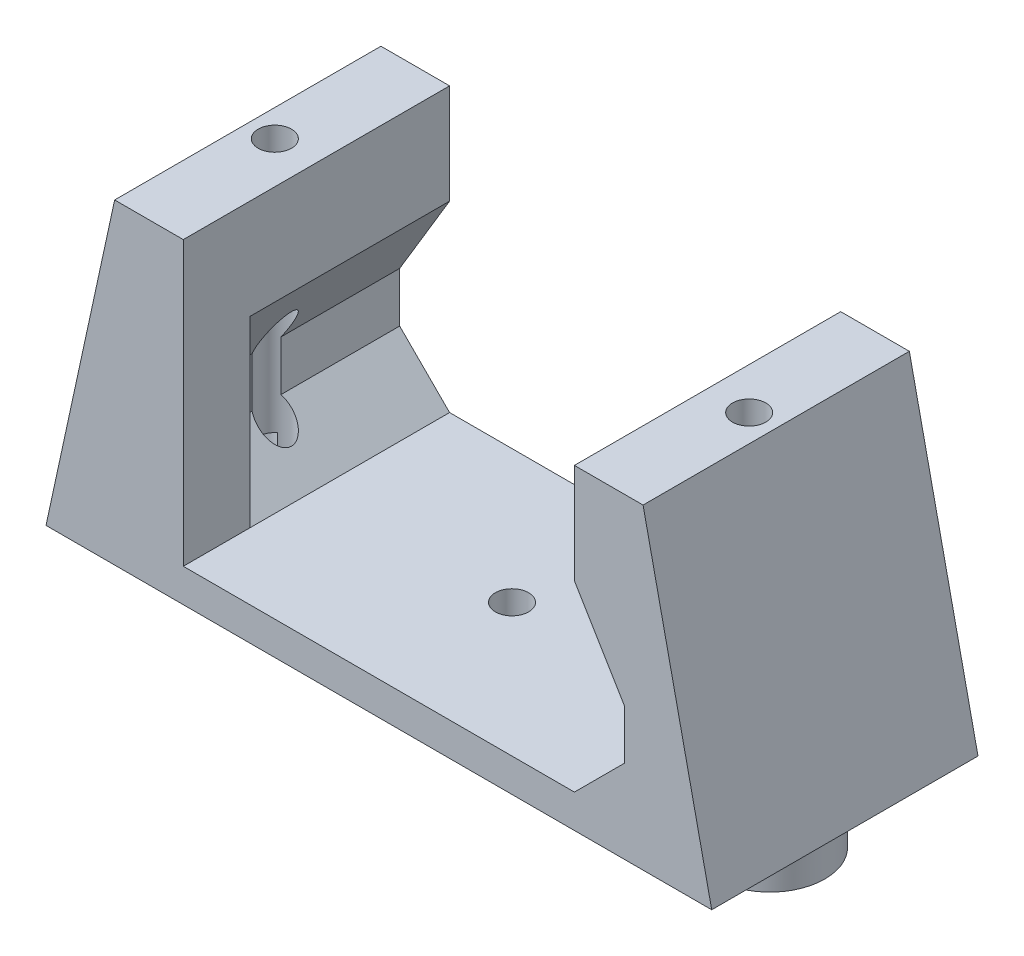
ISO-10303-21;
HEADER;
FILE_DESCRIPTION(('STEP AP214'),'2;1');
FILE_NAME('part.step','',(''),(''),'','','');
FILE_SCHEMA(('AUTOMOTIVE_DESIGN { 1 0 10303 214 1 1 1 1 }'));
ENDSEC;
DATA;
#1=APPLICATION_CONTEXT('core data for automotive mechanical design processes');
#2=APPLICATION_PROTOCOL_DEFINITION('international standard','automotive_design',2000,#1);
#3=PRODUCT_CONTEXT('',#1,'mechanical');
#4=PRODUCT('Part','Part','',(#3));
#5=PRODUCT_RELATED_PRODUCT_CATEGORY('part','',(#4));
#6=PRODUCT_DEFINITION_FORMATION('','',#4);
#7=PRODUCT_DEFINITION_CONTEXT('part definition',#1,'design');
#8=PRODUCT_DEFINITION('design','',#6,#7);
#9=PRODUCT_DEFINITION_SHAPE('','',#8);
#10=(LENGTH_UNIT() NAMED_UNIT(*) SI_UNIT(.MILLI.,.METRE.));
#11=(NAMED_UNIT(*) PLANE_ANGLE_UNIT() SI_UNIT($,.RADIAN.));
#12=(NAMED_UNIT(*) SI_UNIT($,.STERADIAN.) SOLID_ANGLE_UNIT());
#13=UNCERTAINTY_MEASURE_WITH_UNIT(LENGTH_MEASURE(1.E-05),#10,'distance_accuracy_value','');
#14=(GEOMETRIC_REPRESENTATION_CONTEXT(3) GLOBAL_UNCERTAINTY_ASSIGNED_CONTEXT((#13)) GLOBAL_UNIT_ASSIGNED_CONTEXT((#10,
#11,#12)) REPRESENTATION_CONTEXT('',''));
#15=CARTESIAN_POINT('',(0.,0.,0.));
#16=DIRECTION('',(0.,0.,1.));
#17=DIRECTION('',(1.,0.,0.));
#18=AXIS2_PLACEMENT_3D('',#15,#16,#17);
#19=CARTESIAN_POINT('',(14.25,19.,0.));
#20=DIRECTION('',(0.,-1.,0.));
#21=DIRECTION('',(0.,0.,-1.));
#22=AXIS2_PLACEMENT_3D('',#19,#20,#21);
#23=CYLINDRICAL_SURFACE('',#22,1.);
#24=CARTESIAN_POINT('',(14.25,19.,0.));
#25=DIRECTION('',(0.,1.,0.));
#26=DIRECTION('',(0.,0.,1.));
#27=AXIS2_PLACEMENT_3D('',#24,#25,#26);
#28=CIRCLE('',#27,1.);
#29=CARTESIAN_POINT('',(14.25,19.,1.));
#30=VERTEX_POINT('',#29);
#31=EDGE_CURVE('E305',#30,#30,#28,.T.);
#32=ORIENTED_EDGE('',*,*,#31,.T.);
#33=EDGE_LOOP('',(#32));
#34=FACE_BOUND('',#33,.T.);
#35=DIRECTION('',(0.,-1.,0.));
#36=VECTOR('',#35,1.);
#37=CARTESIAN_POINT('',(14.75,19.,-0.866025403784437));
#38=LINE('',#37,#36);
#39=CARTESIAN_POINT('',(14.75,5.,-0.866025403784437));
#40=VERTEX_POINT('',#39);
#41=CARTESIAN_POINT('',(14.75,8.,-0.866025403784437));
#42=VERTEX_POINT('',#41);
#43=EDGE_CURVE('E376',#40,#42,#38,.F.);
#44=ORIENTED_EDGE('',*,*,#43,.F.);
#45=CARTESIAN_POINT('',(14.25,4.50000000000001,0.));
#46=DIRECTION('',(-0.707106781186549,0.707106781186546,0.));
#47=DIRECTION('',(-0.707106781186546,-0.707106781186549,0.));
#48=AXIS2_PLACEMENT_3D('',#45,#46,#47);
#49=ELLIPSE('',#48,1.4142135623731,1.);
#50=CARTESIAN_POINT('',(14.75,5.,0.866025403784437));
#51=VERTEX_POINT('',#50);
#52=EDGE_CURVE('E384',#40,#51,#49,.T.);
#53=ORIENTED_EDGE('',*,*,#52,.T.);
#54=DIRECTION('',(0.,-1.,0.));
#55=VECTOR('',#54,1.);
#56=CARTESIAN_POINT('',(14.75,19.,0.866025403784437));
#57=LINE('',#56,#55);
#58=CARTESIAN_POINT('',(14.75,8.,0.866025403784437));
#59=VERTEX_POINT('',#58);
#60=EDGE_CURVE('E378',#59,#51,#57,.T.);
#61=ORIENTED_EDGE('',*,*,#60,.F.);
#62=CARTESIAN_POINT('',(14.25,8.83333333333334,0.));
#63=DIRECTION('',(-0.857492925712544,-0.514495755427527,0.));
#64=DIRECTION('',(0.514495755427527,-0.857492925712544,0.));
#65=AXIS2_PLACEMENT_3D('',#62,#63,#64);
#66=ELLIPSE('',#65,1.9436506316151,1.);
#67=EDGE_CURVE('E381',#59,#42,#66,.T.);
#68=ORIENTED_EDGE('',*,*,#67,.T.);
#69=EDGE_LOOP('',(#44,#53,#61,#68));
#70=FACE_BOUND('',#69,.T.);
#71=CARTESIAN_POINT('',(14.25,3.,0.));
#72=DIRECTION('',(0.,-1.,0.));
#73=DIRECTION('',(0.,0.,-1.));
#74=AXIS2_PLACEMENT_3D('',#71,#72,#73);
#75=CIRCLE('',#74,1.);
#76=CARTESIAN_POINT('',(14.875,3.,-0.780624749799798));
#77=VERTEX_POINT('',#76);
#78=CARTESIAN_POINT('',(14.875,3.,0.780624749799804));
#79=VERTEX_POINT('',#78);
#80=EDGE_CURVE('E11',#77,#79,#75,.T.);
#81=ORIENTED_EDGE('',*,*,#80,.T.);
#82=DIRECTION('',(0.,-1.,0.));
#83=VECTOR('',#82,1.);
#84=CARTESIAN_POINT('',(14.875,0.,0.780624749799804));
#85=LINE('',#84,#83);
#86=CARTESIAN_POINT('',(14.875,2.,0.780624749799803));
#87=VERTEX_POINT('',#86);
#88=EDGE_CURVE('E196',#79,#87,#85,.T.);
#89=ORIENTED_EDGE('',*,*,#88,.T.);
#90=CARTESIAN_POINT('',(14.25,2.,0.));
#91=DIRECTION('',(0.,1.,0.));
#92=DIRECTION('',(0.,0.,1.));
#93=AXIS2_PLACEMENT_3D('',#90,#91,#92);
#94=CIRCLE('',#93,1.);
#95=CARTESIAN_POINT('',(14.875,2.,-0.780624749799798));
#96=VERTEX_POINT('',#95);
#97=EDGE_CURVE('E201',#87,#96,#94,.F.);
#98=ORIENTED_EDGE('',*,*,#97,.T.);
#99=DIRECTION('',(0.,-1.,0.));
#100=VECTOR('',#99,1.);
#101=CARTESIAN_POINT('',(14.875,0.,-0.780624749799798));
#102=LINE('',#101,#100);
#103=EDGE_CURVE('E58',#96,#77,#102,.F.);
#104=ORIENTED_EDGE('',*,*,#103,.T.);
#105=EDGE_LOOP('',(#81,#89,#98,#104));
#106=FACE_BOUND('',#105,.T.);
#107=ADVANCED_FACE('F35',(#34,#70,#106),#23,.F.);
#108=CARTESIAN_POINT('',(0.,2.,8.));
#109=DIRECTION('',(0.,0.,-1.));
#110=DIRECTION('',(-1.,0.,0.));
#111=AXIS2_PLACEMENT_3D('',#108,#109,#110);
#112=PLANE('',#111);
#113=DIRECTION('',(0.,1.,0.));
#114=VECTOR('',#113,1.);
#115=CARTESIAN_POINT('',(14.75,0.,8.));
#116=LINE('',#115,#114);
#117=CARTESIAN_POINT('',(14.75,5.,8.));
#118=VERTEX_POINT('',#117);
#119=CARTESIAN_POINT('',(14.75,8.,8.));
#120=VERTEX_POINT('',#119);
#121=EDGE_CURVE('E215',#118,#120,#116,.T.);
#122=ORIENTED_EDGE('',*,*,#121,.F.);
#123=DIRECTION('',(-0.707106781186546,-0.707106781186549,0.));
#124=VECTOR('',#123,1.);
#125=CARTESIAN_POINT('',(14.75,5.,8.));
#126=LINE('',#125,#124);
#127=CARTESIAN_POINT('',(11.75,2.,8.));
#128=VERTEX_POINT('',#127);
#129=EDGE_CURVE('E386',#118,#128,#126,.T.);
#130=ORIENTED_EDGE('',*,*,#129,.T.);
#131=DIRECTION('',(1.,0.,0.));
#132=VECTOR('',#131,1.);
#133=CARTESIAN_POINT('',(0.,2.,8.));
#134=LINE('',#133,#132);
#135=CARTESIAN_POINT('',(-11.75,2.,8.));
#136=VERTEX_POINT('',#135);
#137=EDGE_CURVE('E345',#136,#128,#134,.T.);
#138=ORIENTED_EDGE('',*,*,#137,.F.);
#139=DIRECTION('',(0.,-1.,0.));
#140=VECTOR('',#139,1.);
#141=CARTESIAN_POINT('',(-11.75,19.,8.));
#142=LINE('',#141,#140);
#143=CARTESIAN_POINT('',(-11.75,19.,8.));
#144=VERTEX_POINT('',#143);
#145=EDGE_CURVE('E334',#144,#136,#142,.T.);
#146=ORIENTED_EDGE('',*,*,#145,.F.);
#147=DIRECTION('',(1.,0.,0.));
#148=VECTOR('',#147,1.);
#149=CARTESIAN_POINT('',(0.,19.,8.));
#150=LINE('',#149,#148);
#151=CARTESIAN_POINT('',(-15.875,19.,8.));
#152=VERTEX_POINT('',#151);
#153=EDGE_CURVE('E321',#152,#144,#150,.T.);
#154=ORIENTED_EDGE('',*,*,#153,.F.);
#155=DIRECTION('',(-0.212162721266312,-0.977234352499376,0.));
#156=VECTOR('',#155,1.);
#157=CARTESIAN_POINT('',(-19.0997395940975,4.14665399082379,8.));
#158=LINE('',#157,#156);
#159=CARTESIAN_POINT('',(-20.,0.,8.));
#160=VERTEX_POINT('',#159);
#161=EDGE_CURVE('E256',#152,#160,#158,.T.);
#162=ORIENTED_EDGE('',*,*,#161,.T.);
#163=DIRECTION('',(1.,0.,0.));
#164=VECTOR('',#163,1.);
#165=CARTESIAN_POINT('',(0.,0.,8.));
#166=LINE('',#165,#164);
#167=CARTESIAN_POINT('',(20.,0.,8.));
#168=VERTEX_POINT('',#167);
#169=EDGE_CURVE('E344',#160,#168,#166,.T.);
#170=ORIENTED_EDGE('',*,*,#169,.T.);
#171=DIRECTION('',(-0.212162721266312,0.977234352499376,0.));
#172=VECTOR('',#171,1.);
#173=CARTESIAN_POINT('',(19.0997395940975,4.14665399082379,8.));
#174=LINE('',#173,#172);
#175=CARTESIAN_POINT('',(15.875,19.,8.));
#176=VERTEX_POINT('',#175);
#177=EDGE_CURVE('E271',#168,#176,#174,.T.);
#178=ORIENTED_EDGE('',*,*,#177,.T.);
#179=DIRECTION('',(1.,0.,0.));
#180=VECTOR('',#179,1.);
#181=CARTESIAN_POINT('',(0.,19.,8.));
#182=LINE('',#181,#180);
#183=CARTESIAN_POINT('',(11.75,19.,8.));
#184=VERTEX_POINT('',#183);
#185=EDGE_CURVE('E302',#184,#176,#182,.T.);
#186=ORIENTED_EDGE('',*,*,#185,.F.);
#187=DIRECTION('',(0.,-1.,0.));
#188=VECTOR('',#187,1.);
#189=CARTESIAN_POINT('',(11.75,19.,8.));
#190=LINE('',#189,#188);
#191=CARTESIAN_POINT('',(11.75,13.,8.));
#192=VERTEX_POINT('',#191);
#193=EDGE_CURVE('E308',#184,#192,#190,.T.);
#194=ORIENTED_EDGE('',*,*,#193,.T.);
#195=DIRECTION('',(0.514495755427527,-0.857492925712544,0.));
#196=VECTOR('',#195,1.);
#197=CARTESIAN_POINT('',(14.375,8.625,8.));
#198=LINE('',#197,#196);
#199=EDGE_CURVE('E219',#192,#120,#198,.T.);
#200=ORIENTED_EDGE('',*,*,#199,.T.);
#201=EDGE_LOOP('',(#122,#130,#138,#146,#154,#162,#170,#178,#186,#194,#200));
#202=FACE_BOUND('',#201,.T.);
#203=ADVANCED_FACE('F426',(#202),#112,.F.);
#204=CARTESIAN_POINT('',(11.75,19.,0.));
#205=DIRECTION('',(-1.,0.,0.));
#206=DIRECTION('',(0.,0.,1.));
#207=AXIS2_PLACEMENT_3D('',#204,#205,#206);
#208=PLANE('',#207);
#209=DIRECTION('',(0.,0.,1.));
#210=VECTOR('',#209,1.);
#211=CARTESIAN_POINT('',(11.75,2.,0.));
#212=LINE('',#211,#210);
#213=CARTESIAN_POINT('',(11.75,2.,-8.));
#214=VERTEX_POINT('',#213);
#215=CARTESIAN_POINT('',(11.75,2.,-4.));
#216=VERTEX_POINT('',#215);
#217=EDGE_CURVE('E318',#214,#216,#212,.T.);
#218=ORIENTED_EDGE('',*,*,#217,.T.);
#219=DIRECTION('',(0.,-1.,0.));
#220=VECTOR('',#219,1.);
#221=CARTESIAN_POINT('',(11.75,0.,-4.));
#222=LINE('',#221,#220);
#223=CARTESIAN_POINT('',(11.75,13.,-4.));
#224=VERTEX_POINT('',#223);
#225=EDGE_CURVE('E216',#224,#216,#222,.T.);
#226=ORIENTED_EDGE('',*,*,#225,.F.);
#227=DIRECTION('',(0.,0.,1.));
#228=VECTOR('',#227,1.);
#229=CARTESIAN_POINT('',(11.75,13.,-4.));
#230=LINE('',#229,#228);
#231=EDGE_CURVE('E229',#224,#192,#230,.T.);
#232=ORIENTED_EDGE('',*,*,#231,.T.);
#233=ORIENTED_EDGE('',*,*,#193,.F.);
#234=DIRECTION('',(0.,0.,-1.));
#235=VECTOR('',#234,1.);
#236=CARTESIAN_POINT('',(11.75,19.,0.));
#237=LINE('',#236,#235);
#238=CARTESIAN_POINT('',(11.75,19.,-8.));
#239=VERTEX_POINT('',#238);
#240=EDGE_CURVE('E299',#184,#239,#237,.T.);
#241=ORIENTED_EDGE('',*,*,#240,.T.);
#242=DIRECTION('',(0.,-1.,0.));
#243=VECTOR('',#242,1.);
#244=CARTESIAN_POINT('',(11.75,19.,-8.));
#245=LINE('',#244,#243);
#246=EDGE_CURVE('E311',#239,#214,#245,.T.);
#247=ORIENTED_EDGE('',*,*,#246,.T.);
#248=EDGE_LOOP('',(#218,#226,#232,#233,#241,#247));
#249=FACE_BOUND('',#248,.T.);
#250=ADVANCED_FACE('F433',(#249),#208,.T.);
#251=CARTESIAN_POINT('',(0.,2.,-8.));
#252=DIRECTION('',(0.,0.,-1.));
#253=DIRECTION('',(-1.,0.,0.));
#254=AXIS2_PLACEMENT_3D('',#251,#252,#253);
#255=PLANE('',#254);
#256=DIRECTION('',(0.,1.,0.));
#257=VECTOR('',#256,1.);
#258=CARTESIAN_POINT('',(-14.75,0.,-8.));
#259=LINE('',#258,#257);
#260=CARTESIAN_POINT('',(-14.75,5.,-8.));
#261=VERTEX_POINT('',#260);
#262=CARTESIAN_POINT('',(-14.75,8.,-8.));
#263=VERTEX_POINT('',#262);
#264=EDGE_CURVE('E232',#261,#263,#259,.T.);
#265=ORIENTED_EDGE('',*,*,#264,.F.);
#266=DIRECTION('',(-0.707106781186547,0.707106781186548,0.));
#267=VECTOR('',#266,1.);
#268=CARTESIAN_POINT('',(-5.87500000000002,-3.87500000000001,-8.));
#269=LINE('',#268,#267);
#270=CARTESIAN_POINT('',(-11.75,2.,-8.));
#271=VERTEX_POINT('',#270);
#272=EDGE_CURVE('E390',#261,#271,#269,.F.);
#273=ORIENTED_EDGE('',*,*,#272,.T.);
#274=DIRECTION('',(1.,0.,0.));
#275=VECTOR('',#274,1.);
#276=CARTESIAN_POINT('',(0.,2.,-8.));
#277=LINE('',#276,#275);
#278=EDGE_CURVE('E340',#271,#214,#277,.T.);
#279=ORIENTED_EDGE('',*,*,#278,.T.);
#280=ORIENTED_EDGE('',*,*,#246,.F.);
#281=DIRECTION('',(1.,0.,0.));
#282=VECTOR('',#281,1.);
#283=CARTESIAN_POINT('',(0.,19.,-8.));
#284=LINE('',#283,#282);
#285=CARTESIAN_POINT('',(15.875,19.,-8.));
#286=VERTEX_POINT('',#285);
#287=EDGE_CURVE('E296',#239,#286,#284,.T.);
#288=ORIENTED_EDGE('',*,*,#287,.T.);
#289=DIRECTION('',(-0.212162721266312,0.977234352499376,0.));
#290=VECTOR('',#289,1.);
#291=CARTESIAN_POINT('',(19.0997395940975,4.14665399082379,-8.));
#292=LINE('',#291,#290);
#293=CARTESIAN_POINT('',(20.,0.,-8.));
#294=VERTEX_POINT('',#293);
#295=EDGE_CURVE('E272',#294,#286,#292,.T.);
#296=ORIENTED_EDGE('',*,*,#295,.F.);
#297=DIRECTION('',(1.,0.,0.));
#298=VECTOR('',#297,1.);
#299=CARTESIAN_POINT('',(0.,0.,-8.));
#300=LINE('',#299,#298);
#301=CARTESIAN_POINT('',(-20.,0.,-8.));
#302=VERTEX_POINT('',#301);
#303=EDGE_CURVE('E355',#302,#294,#300,.T.);
#304=ORIENTED_EDGE('',*,*,#303,.F.);
#305=DIRECTION('',(-0.212162721266312,-0.977234352499376,0.));
#306=VECTOR('',#305,1.);
#307=CARTESIAN_POINT('',(-19.0997395940975,4.14665399082379,-8.));
#308=LINE('',#307,#306);
#309=CARTESIAN_POINT('',(-15.875,19.,-8.));
#310=VERTEX_POINT('',#309);
#311=EDGE_CURVE('E264',#310,#302,#308,.T.);
#312=ORIENTED_EDGE('',*,*,#311,.F.);
#313=DIRECTION('',(1.,0.,0.));
#314=VECTOR('',#313,1.);
#315=CARTESIAN_POINT('',(0.,19.,-8.));
#316=LINE('',#315,#314);
#317=CARTESIAN_POINT('',(-11.75,19.,-8.));
#318=VERTEX_POINT('',#317);
#319=EDGE_CURVE('E326',#310,#318,#316,.T.);
#320=ORIENTED_EDGE('',*,*,#319,.T.);
#321=DIRECTION('',(0.,-1.,0.));
#322=VECTOR('',#321,1.);
#323=CARTESIAN_POINT('',(-11.75,19.,-8.));
#324=LINE('',#323,#322);
#325=CARTESIAN_POINT('',(-11.75,13.,-8.));
#326=VERTEX_POINT('',#325);
#327=EDGE_CURVE('E331',#318,#326,#324,.T.);
#328=ORIENTED_EDGE('',*,*,#327,.T.);
#329=DIRECTION('',(-0.514495755427526,-0.857492925712544,0.));
#330=VECTOR('',#329,1.);
#331=CARTESIAN_POINT('',(-14.375,8.625,-8.));
#332=LINE('',#331,#330);
#333=EDGE_CURVE('E244',#326,#263,#332,.T.);
#334=ORIENTED_EDGE('',*,*,#333,.T.);
#335=EDGE_LOOP('',(#265,#273,#279,#280,#288,#296,#304,#312,#320,#328,#334));
#336=FACE_BOUND('',#335,.T.);
#337=ADVANCED_FACE('F442',(#336),#255,.T.);
#338=CARTESIAN_POINT('',(0.,19.,0.));
#339=DIRECTION('',(0.,1.,0.));
#340=DIRECTION('',(0.,0.,1.));
#341=AXIS2_PLACEMENT_3D('',#338,#339,#340);
#342=PLANE('',#341);
#343=CARTESIAN_POINT('',(-14.25,19.,0.));
#344=DIRECTION('',(0.,1.,0.));
#345=DIRECTION('',(0.,0.,1.));
#346=AXIS2_PLACEMENT_3D('',#343,#344,#345);
#347=CIRCLE('',#346,1.);
#348=CARTESIAN_POINT('',(-14.25,19.,1.));
#349=VERTEX_POINT('',#348);
#350=EDGE_CURVE('E328',#349,#349,#347,.T.);
#351=ORIENTED_EDGE('',*,*,#350,.F.);
#352=EDGE_LOOP('',(#351));
#353=FACE_BOUND('',#352,.T.);
#354=ORIENTED_EDGE('',*,*,#319,.F.);
#355=DIRECTION('',(0.,0.,1.));
#356=VECTOR('',#355,1.);
#357=CARTESIAN_POINT('',(-15.875,19.,-8.));
#358=LINE('',#357,#356);
#359=EDGE_CURVE('E266',#310,#152,#358,.T.);
#360=ORIENTED_EDGE('',*,*,#359,.T.);
#361=ORIENTED_EDGE('',*,*,#153,.T.);
#362=DIRECTION('',(0.,0.,-1.));
#363=VECTOR('',#362,1.);
#364=CARTESIAN_POINT('',(-11.75,19.,0.));
#365=LINE('',#364,#363);
#366=EDGE_CURVE('E323',#144,#318,#365,.T.);
#367=ORIENTED_EDGE('',*,*,#366,.T.);
#368=EDGE_LOOP('',(#354,#360,#361,#367));
#369=FACE_BOUND('',#368,.T.);
#370=ADVANCED_FACE('F444',(#353,#369),#342,.T.);
#371=CARTESIAN_POINT('',(0.,19.,0.));
#372=DIRECTION('',(0.,1.,0.));
#373=DIRECTION('',(0.,0.,1.));
#374=AXIS2_PLACEMENT_3D('',#371,#372,#373);
#375=PLANE('',#374);
#376=ORIENTED_EDGE('',*,*,#31,.F.);
#377=EDGE_LOOP('',(#376));
#378=FACE_BOUND('',#377,.T.);
#379=ORIENTED_EDGE('',*,*,#185,.T.);
#380=DIRECTION('',(0.,0.,1.));
#381=VECTOR('',#380,1.);
#382=CARTESIAN_POINT('',(15.875,19.,-8.));
#383=LINE('',#382,#381);
#384=EDGE_CURVE('E274',#286,#176,#383,.T.);
#385=ORIENTED_EDGE('',*,*,#384,.F.);
#386=ORIENTED_EDGE('',*,*,#287,.F.);
#387=ORIENTED_EDGE('',*,*,#240,.F.);
#388=EDGE_LOOP('',(#379,#385,#386,#387));
#389=FACE_BOUND('',#388,.T.);
#390=ADVANCED_FACE('F423',(#378,#389),#375,.T.);
#391=CARTESIAN_POINT('',(0.,2.,0.));
#392=DIRECTION('',(0.,1.,0.));
#393=DIRECTION('',(0.,0.,1.));
#394=AXIS2_PLACEMENT_3D('',#391,#392,#393);
#395=PLANE('',#394);
#396=CARTESIAN_POINT('',(0.,2.,0.));
#397=DIRECTION('',(0.,1.,0.));
#398=DIRECTION('',(0.,0.,1.));
#399=AXIS2_PLACEMENT_3D('',#396,#397,#398);
#400=CIRCLE('',#399,1.);
#401=CARTESIAN_POINT('',(0.,2.,1.));
#402=VERTEX_POINT('',#401);
#403=EDGE_CURVE('E212',#402,#402,#400,.T.);
#404=ORIENTED_EDGE('',*,*,#403,.F.);
#405=EDGE_LOOP('',(#404));
#406=FACE_BOUND('',#405,.T.);
#407=ORIENTED_EDGE('',*,*,#217,.F.);
#408=ORIENTED_EDGE('',*,*,#278,.F.);
#409=DIRECTION('',(0.,0.,1.));
#410=VECTOR('',#409,1.);
#411=CARTESIAN_POINT('',(-11.75,2.,0.));
#412=LINE('',#411,#410);
#413=CARTESIAN_POINT('',(-11.75,2.,4.));
#414=VERTEX_POINT('',#413);
#415=EDGE_CURVE('E341',#271,#414,#412,.T.);
#416=ORIENTED_EDGE('',*,*,#415,.T.);
#417=EDGE_CURVE('E337',#414,#136,#412,.T.);
#418=ORIENTED_EDGE('',*,*,#417,.T.);
#419=ORIENTED_EDGE('',*,*,#137,.T.);
#420=EDGE_CURVE('E314',#216,#128,#212,.T.);
#421=ORIENTED_EDGE('',*,*,#420,.F.);
#422=EDGE_LOOP('',(#407,#408,#416,#418,#419,#421));
#423=FACE_BOUND('',#422,.T.);
#424=ADVANCED_FACE('F411',(#406,#423),#395,.T.);
#425=CARTESIAN_POINT('',(0.,0.,0.));
#426=DIRECTION('',(0.,1.,0.));
#427=DIRECTION('',(0.,0.,1.));
#428=AXIS2_PLACEMENT_3D('',#425,#426,#427);
#429=PLANE('',#428);
#430=CARTESIAN_POINT('',(15.5,0.,0.));
#431=DIRECTION('',(0.,1.,0.));
#432=DIRECTION('',(0.,0.,1.));
#433=AXIS2_PLACEMENT_3D('',#430,#431,#432);
#434=CIRCLE('',#433,3.3);
#435=CARTESIAN_POINT('',(15.5,0.,3.30000000000001));
#436=VERTEX_POINT('',#435);
#437=EDGE_CURVE('E365',#436,#436,#434,.F.);
#438=ORIENTED_EDGE('',*,*,#437,.F.);
#439=EDGE_LOOP('',(#438));
#440=FACE_BOUND('',#439,.T.);
#441=CARTESIAN_POINT('',(0.,0.,0.));
#442=DIRECTION('',(0.,1.,0.));
#443=DIRECTION('',(0.,0.,1.));
#444=AXIS2_PLACEMENT_3D('',#441,#442,#443);
#445=CIRCLE('',#444,3.3);
#446=CARTESIAN_POINT('',(0.,0.,3.3));
#447=VERTEX_POINT('',#446);
#448=EDGE_CURVE('E362',#447,#447,#445,.F.);
#449=ORIENTED_EDGE('',*,*,#448,.F.);
#450=EDGE_LOOP('',(#449));
#451=FACE_BOUND('',#450,.T.);
#452=CARTESIAN_POINT('',(-15.5,0.,0.));
#453=DIRECTION('',(0.,1.,0.));
#454=DIRECTION('',(0.,0.,1.));
#455=AXIS2_PLACEMENT_3D('',#452,#453,#454);
#456=CIRCLE('',#455,3.3);
#457=CARTESIAN_POINT('',(-15.5,0.,3.3));
#458=VERTEX_POINT('',#457);
#459=EDGE_CURVE('E316',#458,#458,#456,.F.);
#460=ORIENTED_EDGE('',*,*,#459,.F.);
#461=EDGE_LOOP('',(#460));
#462=FACE_BOUND('',#461,.T.);
#463=DIRECTION('',(0.,0.,-1.));
#464=VECTOR('',#463,1.);
#465=CARTESIAN_POINT('',(20.,0.,0.));
#466=LINE('',#465,#464);
#467=EDGE_CURVE('E353',#168,#294,#466,.T.);
#468=ORIENTED_EDGE('',*,*,#467,.F.);
#469=ORIENTED_EDGE('',*,*,#169,.F.);
#470=DIRECTION('',(0.,0.,-1.));
#471=VECTOR('',#470,1.);
#472=CARTESIAN_POINT('',(-20.,0.,0.));
#473=LINE('',#472,#471);
#474=EDGE_CURVE('E348',#160,#302,#473,.T.);
#475=ORIENTED_EDGE('',*,*,#474,.T.);
#476=ORIENTED_EDGE('',*,*,#303,.T.);
#477=EDGE_LOOP('',(#468,#469,#475,#476));
#478=FACE_BOUND('',#477,.T.);
#479=ADVANCED_FACE('F422',(#440,#451,#462,#478),#429,.F.);
#480=CARTESIAN_POINT('',(-11.75,19.,0.));
#481=DIRECTION('',(-1.,0.,0.));
#482=DIRECTION('',(0.,0.,1.));
#483=AXIS2_PLACEMENT_3D('',#480,#481,#482);
#484=PLANE('',#483);
#485=ORIENTED_EDGE('',*,*,#417,.F.);
#486=DIRECTION('',(0.,-1.,0.));
#487=VECTOR('',#486,1.);
#488=CARTESIAN_POINT('',(-11.75,0.,4.));
#489=LINE('',#488,#487);
#490=CARTESIAN_POINT('',(-11.75,13.,4.));
#491=VERTEX_POINT('',#490);
#492=EDGE_CURVE('E246',#491,#414,#489,.T.);
#493=ORIENTED_EDGE('',*,*,#492,.F.);
#494=DIRECTION('',(0.,0.,-1.));
#495=VECTOR('',#494,1.);
#496=CARTESIAN_POINT('',(-11.75,13.,4.));
#497=LINE('',#496,#495);
#498=EDGE_CURVE('E253',#491,#326,#497,.T.);
#499=ORIENTED_EDGE('',*,*,#498,.T.);
#500=ORIENTED_EDGE('',*,*,#327,.F.);
#501=ORIENTED_EDGE('',*,*,#366,.F.);
#502=ORIENTED_EDGE('',*,*,#145,.T.);
#503=EDGE_LOOP('',(#485,#493,#499,#500,#501,#502));
#504=FACE_BOUND('',#503,.T.);
#505=ADVANCED_FACE('F417',(#504),#484,.F.);
#506=CARTESIAN_POINT('',(-14.25,19.,0.));
#507=DIRECTION('',(0.,-1.,0.));
#508=DIRECTION('',(0.,0.,-1.));
#509=AXIS2_PLACEMENT_3D('',#506,#507,#508);
#510=CYLINDRICAL_SURFACE('',#509,1.);
#511=DIRECTION('',(0.,-1.,0.));
#512=VECTOR('',#511,1.);
#513=CARTESIAN_POINT('',(-14.875,0.,-0.780624749799803));
#514=LINE('',#513,#512);
#515=CARTESIAN_POINT('',(-14.875,2.,-0.780624749799802));
#516=VERTEX_POINT('',#515);
#517=CARTESIAN_POINT('',(-14.875,3.,-0.780624749799803));
#518=VERTEX_POINT('',#517);
#519=EDGE_CURVE('E210',#516,#518,#514,.F.);
#520=ORIENTED_EDGE('',*,*,#519,.F.);
#521=CARTESIAN_POINT('',(-14.25,2.,0.));
#522=DIRECTION('',(0.,1.,0.));
#523=DIRECTION('',(0.,0.,1.));
#524=AXIS2_PLACEMENT_3D('',#521,#522,#523);
#525=CIRCLE('',#524,1.);
#526=CARTESIAN_POINT('',(-14.875,2.,0.780624749799799));
#527=VERTEX_POINT('',#526);
#528=EDGE_CURVE('E317',#516,#527,#525,.F.);
#529=ORIENTED_EDGE('',*,*,#528,.T.);
#530=DIRECTION('',(0.,-1.,0.));
#531=VECTOR('',#530,1.);
#532=CARTESIAN_POINT('',(-14.875,0.,0.780624749799799));
#533=LINE('',#532,#531);
#534=CARTESIAN_POINT('',(-14.875,3.,0.780624749799799));
#535=VERTEX_POINT('',#534);
#536=EDGE_CURVE('E50',#535,#527,#533,.T.);
#537=ORIENTED_EDGE('',*,*,#536,.F.);
#538=CARTESIAN_POINT('',(-14.25,3.,0.));
#539=DIRECTION('',(0.,-1.,0.));
#540=DIRECTION('',(0.,0.,-1.));
#541=AXIS2_PLACEMENT_3D('',#538,#539,#540);
#542=CIRCLE('',#541,1.);
#543=EDGE_CURVE('E43',#535,#518,#542,.T.);
#544=ORIENTED_EDGE('',*,*,#543,.T.);
#545=EDGE_LOOP('',(#520,#529,#537,#544));
#546=FACE_BOUND('',#545,.T.);
#547=DIRECTION('',(0.,-1.,0.));
#548=VECTOR('',#547,1.);
#549=CARTESIAN_POINT('',(-14.75,19.,0.866025403784439));
#550=LINE('',#549,#548);
#551=CARTESIAN_POINT('',(-14.75,5.,0.866025403784439));
#552=VERTEX_POINT('',#551);
#553=CARTESIAN_POINT('',(-14.75,8.,0.866025403784439));
#554=VERTEX_POINT('',#553);
#555=EDGE_CURVE('E368',#552,#554,#550,.F.);
#556=ORIENTED_EDGE('',*,*,#555,.F.);
#557=CARTESIAN_POINT('',(-14.25,4.49999999999999,0.));
#558=DIRECTION('',(-0.707106781186548,-0.707106781186547,0.));
#559=DIRECTION('',(0.707106781186547,-0.707106781186548,0.));
#560=AXIS2_PLACEMENT_3D('',#557,#558,#559);
#561=ELLIPSE('',#560,1.4142135623731,1.);
#562=CARTESIAN_POINT('',(-14.75,5.,-0.866025403784439));
#563=VERTEX_POINT('',#562);
#564=EDGE_CURVE('E388',#552,#563,#561,.F.);
#565=ORIENTED_EDGE('',*,*,#564,.T.);
#566=DIRECTION('',(0.,-1.,0.));
#567=VECTOR('',#566,1.);
#568=CARTESIAN_POINT('',(-14.75,19.,-0.866025403784439));
#569=LINE('',#568,#567);
#570=CARTESIAN_POINT('',(-14.75,8.,-0.866025403784439));
#571=VERTEX_POINT('',#570);
#572=EDGE_CURVE('E373',#571,#563,#569,.T.);
#573=ORIENTED_EDGE('',*,*,#572,.F.);
#574=CARTESIAN_POINT('',(-14.25,8.83333333333333,0.));
#575=DIRECTION('',(0.857492925712544,-0.514495755427527,0.));
#576=DIRECTION('',(-0.514495755427527,-0.857492925712544,0.));
#577=AXIS2_PLACEMENT_3D('',#574,#575,#576);
#578=ELLIPSE('',#577,1.9436506316151,1.);
#579=EDGE_CURVE('E370',#571,#554,#578,.T.);
#580=ORIENTED_EDGE('',*,*,#579,.T.);
#581=EDGE_LOOP('',(#556,#565,#573,#580));
#582=FACE_BOUND('',#581,.T.);
#583=ORIENTED_EDGE('',*,*,#350,.T.);
#584=EDGE_LOOP('',(#583));
#585=FACE_BOUND('',#584,.T.);
#586=ADVANCED_FACE('F398',(#546,#582,#585),#510,.F.);
#587=CARTESIAN_POINT('',(-15.5,2.,0.));
#588=DIRECTION('',(0.,1.,0.));
#589=DIRECTION('',(0.,0.,1.));
#590=AXIS2_PLACEMENT_3D('',#587,#588,#589);
#591=CIRCLE('',#590,1.);
#592=EDGE_CURVE('E204',#527,#516,#591,.T.);
#593=ORIENTED_EDGE('',*,*,#592,.F.);
#594=ORIENTED_EDGE('',*,*,#528,.F.);
#595=EDGE_LOOP('',(#593,#594));
#596=FACE_BOUND('',#595,.T.);
#597=ADVANCED_FACE('F407',(#596),#395,.T.);
#598=ORIENTED_EDGE('',*,*,#97,.F.);
#599=CARTESIAN_POINT('',(15.5,2.,0.));
#600=DIRECTION('',(0.,1.,0.));
#601=DIRECTION('',(0.,0.,1.));
#602=AXIS2_PLACEMENT_3D('',#599,#600,#601);
#603=CIRCLE('',#602,1.);
#604=EDGE_CURVE('E202',#87,#96,#603,.F.);
#605=ORIENTED_EDGE('',*,*,#604,.T.);
#606=EDGE_LOOP('',(#598,#605));
#607=FACE_BOUND('',#606,.T.);
#608=ADVANCED_FACE('F409',(#607),#395,.T.);
#609=CARTESIAN_POINT('',(-15.5,-3.,0.));
#610=DIRECTION('',(0.,1.,0.));
#611=DIRECTION('',(0.,0.,1.));
#612=AXIS2_PLACEMENT_3D('',#609,#610,#611);
#613=CYLINDRICAL_SURFACE('',#612,1.);
#614=CARTESIAN_POINT('',(-15.5,-3.,0.));
#615=DIRECTION('',(0.,-1.,0.));
#616=DIRECTION('',(0.,0.,-1.));
#617=AXIS2_PLACEMENT_3D('',#614,#615,#616);
#618=CIRCLE('',#617,1.);
#619=CARTESIAN_POINT('',(-15.5,-3.,-1.00000000000001));
#620=VERTEX_POINT('',#619);
#621=EDGE_CURVE('E290',#620,#620,#618,.T.);
#622=ORIENTED_EDGE('',*,*,#621,.T.);
#623=EDGE_LOOP('',(#622));
#624=FACE_BOUND('',#623,.T.);
#625=ORIENTED_EDGE('',*,*,#519,.T.);
#626=CARTESIAN_POINT('',(-15.5,3.,0.));
#627=DIRECTION('',(0.,-1.,0.));
#628=DIRECTION('',(0.,0.,-1.));
#629=AXIS2_PLACEMENT_3D('',#626,#627,#628);
#630=CIRCLE('',#629,1.);
#631=EDGE_CURVE('E197',#535,#518,#630,.T.);
#632=ORIENTED_EDGE('',*,*,#631,.F.);
#633=ORIENTED_EDGE('',*,*,#536,.T.);
#634=ORIENTED_EDGE('',*,*,#592,.T.);
#635=EDGE_LOOP('',(#625,#632,#633,#634));
#636=FACE_BOUND('',#635,.T.);
#637=ADVANCED_FACE('F404',(#624,#636),#613,.F.);
#638=CARTESIAN_POINT('',(-15.5,-3.,0.));
#639=DIRECTION('',(0.,1.,0.));
#640=DIRECTION('',(0.,0.,1.));
#641=AXIS2_PLACEMENT_3D('',#638,#639,#640);
#642=CYLINDRICAL_SURFACE('',#641,3.3);
#643=CARTESIAN_POINT('',(-15.5,-3.,0.));
#644=DIRECTION('',(0.,-1.,0.));
#645=DIRECTION('',(0.,0.,-1.));
#646=AXIS2_PLACEMENT_3D('',#643,#644,#645);
#647=CIRCLE('',#646,3.3);
#648=CARTESIAN_POINT('',(-15.5,-3.,-3.30000000000001));
#649=VERTEX_POINT('',#648);
#650=EDGE_CURVE('E293',#649,#649,#647,.T.);
#651=ORIENTED_EDGE('',*,*,#650,.F.);
#652=EDGE_LOOP('',(#651));
#653=FACE_BOUND('',#652,.T.);
#654=ORIENTED_EDGE('',*,*,#459,.T.);
#655=EDGE_LOOP('',(#654));
#656=FACE_BOUND('',#655,.T.);
#657=ADVANCED_FACE('F563',(#653,#656),#642,.T.);
#658=CARTESIAN_POINT('',(0.,-3.,0.));
#659=DIRECTION('',(0.,-1.,0.));
#660=DIRECTION('',(0.,0.,-1.));
#661=AXIS2_PLACEMENT_3D('',#658,#659,#660);
#662=PLANE('',#661);
#663=ORIENTED_EDGE('',*,*,#621,.F.);
#664=EDGE_LOOP('',(#663));
#665=FACE_BOUND('',#664,.T.);
#666=ORIENTED_EDGE('',*,*,#650,.T.);
#667=EDGE_LOOP('',(#666));
#668=FACE_BOUND('',#667,.T.);
#669=ADVANCED_FACE('F559',(#665,#668),#662,.T.);
#670=CARTESIAN_POINT('',(0.,-3.,0.));
#671=DIRECTION('',(0.,1.,0.));
#672=DIRECTION('',(0.,0.,1.));
#673=AXIS2_PLACEMENT_3D('',#670,#671,#672);
#674=CYLINDRICAL_SURFACE('',#673,3.3);
#675=CARTESIAN_POINT('',(0.,-3.,0.));
#676=DIRECTION('',(0.,-1.,0.));
#677=DIRECTION('',(0.,0.,-1.));
#678=AXIS2_PLACEMENT_3D('',#675,#676,#677);
#679=CIRCLE('',#678,3.3);
#680=CARTESIAN_POINT('',(0.,-3.,-3.3));
#681=VERTEX_POINT('',#680);
#682=EDGE_CURVE('E284',#681,#681,#679,.T.);
#683=ORIENTED_EDGE('',*,*,#682,.F.);
#684=EDGE_LOOP('',(#683));
#685=FACE_BOUND('',#684,.T.);
#686=ORIENTED_EDGE('',*,*,#448,.T.);
#687=EDGE_LOOP('',(#686));
#688=FACE_BOUND('',#687,.T.);
#689=ADVANCED_FACE('F555',(#685,#688),#674,.T.);
#690=CARTESIAN_POINT('',(0.,-3.,0.));
#691=DIRECTION('',(0.,1.,0.));
#692=DIRECTION('',(0.,0.,1.));
#693=AXIS2_PLACEMENT_3D('',#690,#691,#692);
#694=CYLINDRICAL_SURFACE('',#693,1.);
#695=CARTESIAN_POINT('',(0.,-3.,0.));
#696=DIRECTION('',(0.,-1.,0.));
#697=DIRECTION('',(0.,0.,-1.));
#698=AXIS2_PLACEMENT_3D('',#695,#696,#697);
#699=CIRCLE('',#698,1.);
#700=CARTESIAN_POINT('',(0.,-3.,-1.));
#701=VERTEX_POINT('',#700);
#702=EDGE_CURVE('E287',#701,#701,#699,.T.);
#703=ORIENTED_EDGE('',*,*,#702,.T.);
#704=EDGE_LOOP('',(#703));
#705=FACE_BOUND('',#704,.T.);
#706=ORIENTED_EDGE('',*,*,#403,.T.);
#707=EDGE_LOOP('',(#706));
#708=FACE_BOUND('',#707,.T.);
#709=ADVANCED_FACE('F551',(#705,#708),#694,.F.);
#710=CARTESIAN_POINT('',(0.,-3.,0.));
#711=DIRECTION('',(0.,-1.,0.));
#712=DIRECTION('',(0.,0.,-1.));
#713=AXIS2_PLACEMENT_3D('',#710,#711,#712);
#714=PLANE('',#713);
#715=ORIENTED_EDGE('',*,*,#682,.T.);
#716=EDGE_LOOP('',(#715));
#717=FACE_BOUND('',#716,.T.);
#718=ORIENTED_EDGE('',*,*,#702,.F.);
#719=EDGE_LOOP('',(#718));
#720=FACE_BOUND('',#719,.T.);
#721=ADVANCED_FACE('F547',(#717,#720),#714,.T.);
#722=CARTESIAN_POINT('',(15.5,-3.,0.));
#723=DIRECTION('',(0.,1.,0.));
#724=DIRECTION('',(0.,0.,1.));
#725=AXIS2_PLACEMENT_3D('',#722,#723,#724);
#726=CYLINDRICAL_SURFACE('',#725,3.3);
#727=CARTESIAN_POINT('',(15.5,-3.,0.));
#728=DIRECTION('',(0.,-1.,0.));
#729=DIRECTION('',(0.,0.,-1.));
#730=AXIS2_PLACEMENT_3D('',#727,#728,#729);
#731=CIRCLE('',#730,3.3);
#732=CARTESIAN_POINT('',(15.5,-3.,-3.3));
#733=VERTEX_POINT('',#732);
#734=EDGE_CURVE('E278',#733,#733,#731,.T.);
#735=ORIENTED_EDGE('',*,*,#734,.F.);
#736=EDGE_LOOP('',(#735));
#737=FACE_BOUND('',#736,.T.);
#738=ORIENTED_EDGE('',*,*,#437,.T.);
#739=EDGE_LOOP('',(#738));
#740=FACE_BOUND('',#739,.T.);
#741=ADVANCED_FACE('F543',(#737,#740),#726,.T.);
#742=CARTESIAN_POINT('',(15.5,-3.,0.));
#743=DIRECTION('',(0.,1.,0.));
#744=DIRECTION('',(0.,0.,1.));
#745=AXIS2_PLACEMENT_3D('',#742,#743,#744);
#746=CYLINDRICAL_SURFACE('',#745,1.);
#747=CARTESIAN_POINT('',(15.5,-3.,0.));
#748=DIRECTION('',(0.,-1.,0.));
#749=DIRECTION('',(0.,0.,-1.));
#750=AXIS2_PLACEMENT_3D('',#747,#748,#749);
#751=CIRCLE('',#750,1.);
#752=CARTESIAN_POINT('',(15.5,-3.,-0.999999999999996));
#753=VERTEX_POINT('',#752);
#754=EDGE_CURVE('E281',#753,#753,#751,.T.);
#755=ORIENTED_EDGE('',*,*,#754,.T.);
#756=EDGE_LOOP('',(#755));
#757=FACE_BOUND('',#756,.T.);
#758=CARTESIAN_POINT('',(15.5,3.,0.));
#759=DIRECTION('',(0.,-1.,0.));
#760=DIRECTION('',(0.,0.,-1.));
#761=AXIS2_PLACEMENT_3D('',#758,#759,#760);
#762=CIRCLE('',#761,1.);
#763=EDGE_CURVE('E192',#79,#77,#762,.F.);
#764=ORIENTED_EDGE('',*,*,#763,.T.);
#765=ORIENTED_EDGE('',*,*,#103,.F.);
#766=ORIENTED_EDGE('',*,*,#604,.F.);
#767=ORIENTED_EDGE('',*,*,#88,.F.);
#768=EDGE_LOOP('',(#764,#765,#766,#767));
#769=FACE_BOUND('',#768,.T.);
#770=ADVANCED_FACE('F195',(#757,#769),#746,.F.);
#771=CARTESIAN_POINT('',(0.,-3.,0.));
#772=DIRECTION('',(0.,-1.,0.));
#773=DIRECTION('',(0.,0.,-1.));
#774=AXIS2_PLACEMENT_3D('',#771,#772,#773);
#775=PLANE('',#774);
#776=ORIENTED_EDGE('',*,*,#734,.T.);
#777=EDGE_LOOP('',(#776));
#778=FACE_BOUND('',#777,.T.);
#779=ORIENTED_EDGE('',*,*,#754,.F.);
#780=EDGE_LOOP('',(#779));
#781=FACE_BOUND('',#780,.T.);
#782=ADVANCED_FACE('F534',(#778,#781),#775,.T.);
#783=CARTESIAN_POINT('',(19.0997395940975,4.14665399082379,-8.));
#784=DIRECTION('',(0.977234352499375,0.212162721266312,0.));
#785=DIRECTION('',(-0.212162721266312,0.977234352499375,0.));
#786=AXIS2_PLACEMENT_3D('',#783,#784,#785);
#787=PLANE('',#786);
#788=ORIENTED_EDGE('',*,*,#177,.F.);
#789=ORIENTED_EDGE('',*,*,#467,.T.);
#790=ORIENTED_EDGE('',*,*,#295,.T.);
#791=ORIENTED_EDGE('',*,*,#384,.T.);
#792=EDGE_LOOP('',(#788,#789,#790,#791));
#793=FACE_BOUND('',#792,.T.);
#794=ADVANCED_FACE('F527',(#793),#787,.T.);
#795=CARTESIAN_POINT('',(-19.0997395940975,4.14665399082379,-8.));
#796=DIRECTION('',(-0.977234352499375,0.212162721266312,0.));
#797=DIRECTION('',(-0.212162721266312,-0.977234352499375,0.));
#798=AXIS2_PLACEMENT_3D('',#795,#796,#797);
#799=PLANE('',#798);
#800=ORIENTED_EDGE('',*,*,#161,.F.);
#801=ORIENTED_EDGE('',*,*,#359,.F.);
#802=ORIENTED_EDGE('',*,*,#311,.T.);
#803=ORIENTED_EDGE('',*,*,#474,.F.);
#804=EDGE_LOOP('',(#800,#801,#802,#803));
#805=FACE_BOUND('',#804,.T.);
#806=ADVANCED_FACE('F525',(#805),#799,.T.);
#807=CARTESIAN_POINT('',(-14.75,0.,4.));
#808=DIRECTION('',(-1.,0.,0.));
#809=DIRECTION('',(0.,0.,1.));
#810=AXIS2_PLACEMENT_3D('',#807,#808,#809);
#811=PLANE('',#810);
#812=ORIENTED_EDGE('',*,*,#572,.T.);
#813=DIRECTION('',(0.,0.,-1.));
#814=VECTOR('',#813,1.);
#815=CARTESIAN_POINT('',(-14.75,5.,4.));
#816=LINE('',#815,#814);
#817=EDGE_CURVE('E248',#563,#261,#816,.T.);
#818=ORIENTED_EDGE('',*,*,#817,.T.);
#819=ORIENTED_EDGE('',*,*,#264,.T.);
#820=DIRECTION('',(0.,0.,-1.));
#821=VECTOR('',#820,1.);
#822=CARTESIAN_POINT('',(-14.75,8.,4.));
#823=LINE('',#822,#821);
#824=EDGE_CURVE('E260',#571,#263,#823,.T.);
#825=ORIENTED_EDGE('',*,*,#824,.F.);
#826=EDGE_LOOP('',(#812,#818,#819,#825));
#827=FACE_BOUND('',#826,.T.);
#828=ADVANCED_FACE('F481',(#827),#811,.F.);
#829=CARTESIAN_POINT('',(-14.375,8.625,4.));
#830=DIRECTION('',(0.857492925712544,-0.514495755427527,0.));
#831=DIRECTION('',(0.514495755427527,0.857492925712544,0.));
#832=AXIS2_PLACEMENT_3D('',#829,#830,#831);
#833=PLANE('',#832);
#834=ORIENTED_EDGE('',*,*,#824,.T.);
#835=ORIENTED_EDGE('',*,*,#333,.F.);
#836=ORIENTED_EDGE('',*,*,#498,.F.);
#837=DIRECTION('',(-0.514495755427526,-0.857492925712544,0.));
#838=VECTOR('',#837,1.);
#839=CARTESIAN_POINT('',(-14.375,8.625,4.));
#840=LINE('',#839,#838);
#841=CARTESIAN_POINT('',(-14.75,8.,4.));
#842=VERTEX_POINT('',#841);
#843=EDGE_CURVE('E243',#491,#842,#840,.T.);
#844=ORIENTED_EDGE('',*,*,#843,.T.);
#845=EDGE_CURVE('E257',#842,#554,#823,.T.);
#846=ORIENTED_EDGE('',*,*,#845,.T.);
#847=ORIENTED_EDGE('',*,*,#579,.F.);
#848=EDGE_LOOP('',(#834,#835,#836,#844,#846,#847));
#849=FACE_BOUND('',#848,.T.);
#850=ADVANCED_FACE('F474',(#849),#833,.T.);
#851=ORIENTED_EDGE('',*,*,#555,.T.);
#852=ORIENTED_EDGE('',*,*,#845,.F.);
#853=DIRECTION('',(0.,1.,0.));
#854=VECTOR('',#853,1.);
#855=CARTESIAN_POINT('',(-14.75,0.,4.));
#856=LINE('',#855,#854);
#857=CARTESIAN_POINT('',(-14.75,5.,4.));
#858=VERTEX_POINT('',#857);
#859=EDGE_CURVE('E240',#858,#842,#856,.T.);
#860=ORIENTED_EDGE('',*,*,#859,.F.);
#861=EDGE_CURVE('E261',#858,#552,#816,.T.);
#862=ORIENTED_EDGE('',*,*,#861,.T.);
#863=EDGE_LOOP('',(#851,#852,#860,#862));
#864=FACE_BOUND('',#863,.T.);
#865=ADVANCED_FACE('F471',(#864),#811,.F.);
#866=CARTESIAN_POINT('',(0.,0.,4.));
#867=DIRECTION('',(0.,0.,-1.));
#868=DIRECTION('',(-1.,0.,0.));
#869=AXIS2_PLACEMENT_3D('',#866,#867,#868);
#870=PLANE('',#869);
#871=ORIENTED_EDGE('',*,*,#492,.T.);
#872=DIRECTION('',(0.707106781186547,-0.707106781186548,0.));
#873=VECTOR('',#872,1.);
#874=CARTESIAN_POINT('',(-14.75,5.,4.));
#875=LINE('',#874,#873);
#876=EDGE_CURVE('E394',#414,#858,#875,.F.);
#877=ORIENTED_EDGE('',*,*,#876,.T.);
#878=ORIENTED_EDGE('',*,*,#859,.T.);
#879=ORIENTED_EDGE('',*,*,#843,.F.);
#880=EDGE_LOOP('',(#871,#877,#878,#879));
#881=FACE_BOUND('',#880,.T.);
#882=ADVANCED_FACE('F468',(#881),#870,.T.);
#883=CARTESIAN_POINT('',(14.75,0.,-4.));
#884=DIRECTION('',(1.,0.,0.));
#885=DIRECTION('',(0.,0.,-1.));
#886=AXIS2_PLACEMENT_3D('',#883,#884,#885);
#887=PLANE('',#886);
#888=ORIENTED_EDGE('',*,*,#60,.T.);
#889=DIRECTION('',(0.,0.,1.));
#890=VECTOR('',#889,1.);
#891=CARTESIAN_POINT('',(14.75,5.,-4.));
#892=LINE('',#891,#890);
#893=EDGE_CURVE('E224',#51,#118,#892,.T.);
#894=ORIENTED_EDGE('',*,*,#893,.T.);
#895=ORIENTED_EDGE('',*,*,#121,.T.);
#896=DIRECTION('',(0.,0.,1.));
#897=VECTOR('',#896,1.);
#898=CARTESIAN_POINT('',(14.75,8.,-4.));
#899=LINE('',#898,#897);
#900=EDGE_CURVE('E236',#59,#120,#899,.T.);
#901=ORIENTED_EDGE('',*,*,#900,.F.);
#902=EDGE_LOOP('',(#888,#894,#895,#901));
#903=FACE_BOUND('',#902,.T.);
#904=ADVANCED_FACE('F511',(#903),#887,.F.);
#905=CARTESIAN_POINT('',(14.375,8.625,-4.));
#906=DIRECTION('',(-0.857492925712544,-0.514495755427527,0.));
#907=DIRECTION('',(0.514495755427527,-0.857492925712544,0.));
#908=AXIS2_PLACEMENT_3D('',#905,#906,#907);
#909=PLANE('',#908);
#910=ORIENTED_EDGE('',*,*,#900,.T.);
#911=ORIENTED_EDGE('',*,*,#199,.F.);
#912=ORIENTED_EDGE('',*,*,#231,.F.);
#913=DIRECTION('',(0.514495755427527,-0.857492925712544,0.));
#914=VECTOR('',#913,1.);
#915=CARTESIAN_POINT('',(14.375,8.625,-4.));
#916=LINE('',#915,#914);
#917=CARTESIAN_POINT('',(14.75,8.,-4.));
#918=VERTEX_POINT('',#917);
#919=EDGE_CURVE('E222',#224,#918,#916,.T.);
#920=ORIENTED_EDGE('',*,*,#919,.T.);
#921=EDGE_CURVE('E233',#918,#42,#899,.T.);
#922=ORIENTED_EDGE('',*,*,#921,.T.);
#923=ORIENTED_EDGE('',*,*,#67,.F.);
#924=EDGE_LOOP('',(#910,#911,#912,#920,#922,#923));
#925=FACE_BOUND('',#924,.T.);
#926=ADVANCED_FACE('F506',(#925),#909,.T.);
#927=ORIENTED_EDGE('',*,*,#43,.T.);
#928=ORIENTED_EDGE('',*,*,#921,.F.);
#929=DIRECTION('',(0.,1.,0.));
#930=VECTOR('',#929,1.);
#931=CARTESIAN_POINT('',(14.75,0.,-4.));
#932=LINE('',#931,#930);
#933=CARTESIAN_POINT('',(14.75,5.,-4.));
#934=VERTEX_POINT('',#933);
#935=EDGE_CURVE('E218',#934,#918,#932,.T.);
#936=ORIENTED_EDGE('',*,*,#935,.F.);
#937=EDGE_CURVE('E237',#934,#40,#892,.T.);
#938=ORIENTED_EDGE('',*,*,#937,.T.);
#939=EDGE_LOOP('',(#927,#928,#936,#938));
#940=FACE_BOUND('',#939,.T.);
#941=ADVANCED_FACE('F503',(#940),#887,.F.);
#942=CARTESIAN_POINT('',(0.,0.,-4.));
#943=DIRECTION('',(0.,0.,1.));
#944=DIRECTION('',(1.,0.,0.));
#945=AXIS2_PLACEMENT_3D('',#942,#943,#944);
#946=PLANE('',#945);
#947=ORIENTED_EDGE('',*,*,#225,.T.);
#948=DIRECTION('',(0.707106781186546,0.707106781186549,0.));
#949=VECTOR('',#948,1.);
#950=CARTESIAN_POINT('',(14.75,5.,-4.));
#951=LINE('',#950,#949);
#952=EDGE_CURVE('E392',#216,#934,#951,.T.);
#953=ORIENTED_EDGE('',*,*,#952,.T.);
#954=ORIENTED_EDGE('',*,*,#935,.T.);
#955=ORIENTED_EDGE('',*,*,#919,.F.);
#956=EDGE_LOOP('',(#947,#953,#954,#955));
#957=FACE_BOUND('',#956,.T.);
#958=ADVANCED_FACE('F499',(#957),#946,.T.);
#959=CARTESIAN_POINT('',(14.75,5.,-4.));
#960=DIRECTION('',(-0.707106781186549,0.707106781186546,0.));
#961=DIRECTION('',(0.,0.,-1.));
#962=AXIS2_PLACEMENT_3D('',#959,#960,#961);
#963=PLANE('',#962);
#964=ORIENTED_EDGE('',*,*,#952,.F.);
#965=ORIENTED_EDGE('',*,*,#420,.T.);
#966=ORIENTED_EDGE('',*,*,#129,.F.);
#967=ORIENTED_EDGE('',*,*,#893,.F.);
#968=ORIENTED_EDGE('',*,*,#52,.F.);
#969=ORIENTED_EDGE('',*,*,#937,.F.);
#970=EDGE_LOOP('',(#964,#965,#966,#967,#968,#969));
#971=FACE_BOUND('',#970,.T.);
#972=ADVANCED_FACE('F494',(#971),#963,.T.);
#973=CARTESIAN_POINT('',(-14.75,5.,4.));
#974=DIRECTION('',(-0.707106781186548,-0.707106781186547,0.));
#975=DIRECTION('',(0.,0.,-1.));
#976=AXIS2_PLACEMENT_3D('',#973,#974,#975);
#977=PLANE('',#976);
#978=ORIENTED_EDGE('',*,*,#876,.F.);
#979=ORIENTED_EDGE('',*,*,#415,.F.);
#980=ORIENTED_EDGE('',*,*,#272,.F.);
#981=ORIENTED_EDGE('',*,*,#817,.F.);
#982=ORIENTED_EDGE('',*,*,#564,.F.);
#983=ORIENTED_EDGE('',*,*,#861,.F.);
#984=EDGE_LOOP('',(#978,#979,#980,#981,#982,#983));
#985=FACE_BOUND('',#984,.T.);
#986=ADVANCED_FACE('F37',(#985),#977,.F.);
#987=CARTESIAN_POINT('',(0.,3.,0.));
#988=DIRECTION('',(0.,-1.,0.));
#989=DIRECTION('',(0.,0.,-1.));
#990=AXIS2_PLACEMENT_3D('',#987,#988,#989);
#991=PLANE('',#990);
#992=ORIENTED_EDGE('',*,*,#763,.F.);
#993=ORIENTED_EDGE('',*,*,#80,.F.);
#994=EDGE_LOOP('',(#992,#993));
#995=FACE_BOUND('',#994,.T.);
#996=ADVANCED_FACE('F191',(#995),#991,.T.);
#997=CARTESIAN_POINT('',(0.,3.,0.));
#998=DIRECTION('',(0.,-1.,0.));
#999=DIRECTION('',(0.,0.,-1.));
#1000=AXIS2_PLACEMENT_3D('',#997,#998,#999);
#1001=PLANE('',#1000);
#1002=ORIENTED_EDGE('',*,*,#631,.T.);
#1003=ORIENTED_EDGE('',*,*,#543,.F.);
#1004=EDGE_LOOP('',(#1002,#1003));
#1005=FACE_BOUND('',#1004,.T.);
#1006=ADVANCED_FACE('F403',(#1005),#1001,.T.);
#1007=CLOSED_SHELL('',(#107,#203,#250,#337,#370,#390,#424,#479,#505,#586,#597,#608,#637,#657,
#669,#689,#709,#721,#741,#770,#782,#794,#806,#828,#850,#865,#882,#904,#926,#941,#958,#972,#986,
#996,#1006));
#1008=MANIFOLD_SOLID_BREP('B2',#1007);
#1009=ADVANCED_BREP_SHAPE_REPRESENTATION('',(#18,#1008),#14);
#1010=SHAPE_DEFINITION_REPRESENTATION(#9,#1009);
ENDSEC;
END-ISO-10303-21;
